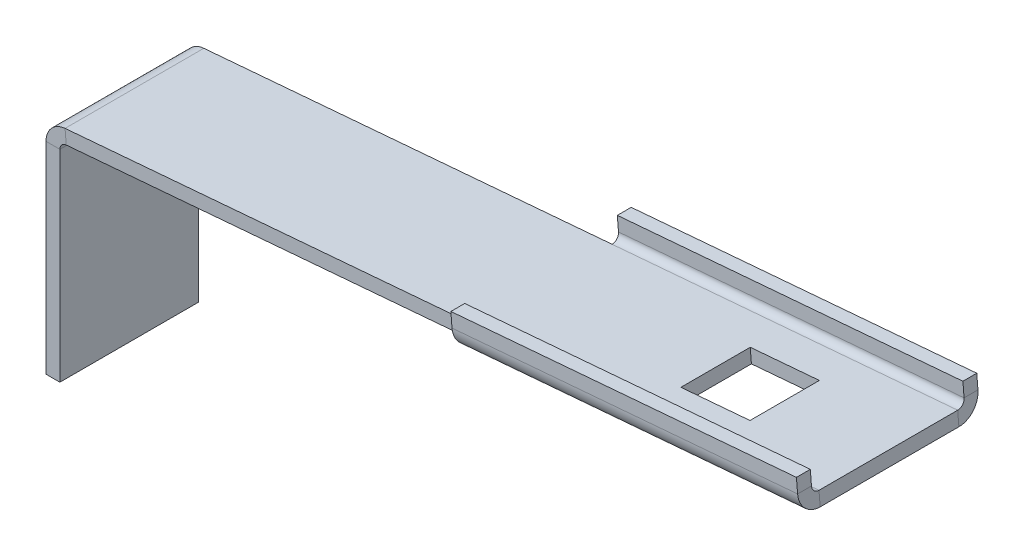
ISO-10303-21;
HEADER;
FILE_DESCRIPTION(('STEP AP214'),'2;1');
FILE_NAME('part.step','',(''),(''),'','','');
FILE_SCHEMA(('AUTOMOTIVE_DESIGN { 1 0 10303 214 1 1 1 1 }'));
ENDSEC;
DATA;
#1=APPLICATION_CONTEXT('core data for automotive mechanical design processes');
#2=APPLICATION_PROTOCOL_DEFINITION('international standard','automotive_design',2000,#1);
#3=PRODUCT_CONTEXT('',#1,'mechanical');
#4=PRODUCT('Part','Part','',(#3));
#5=PRODUCT_RELATED_PRODUCT_CATEGORY('part','',(#4));
#6=PRODUCT_DEFINITION_FORMATION('','',#4);
#7=PRODUCT_DEFINITION_CONTEXT('part definition',#1,'design');
#8=PRODUCT_DEFINITION('design','',#6,#7);
#9=PRODUCT_DEFINITION_SHAPE('','',#8);
#10=(LENGTH_UNIT() NAMED_UNIT(*) SI_UNIT(.MILLI.,.METRE.));
#11=(NAMED_UNIT(*) PLANE_ANGLE_UNIT() SI_UNIT($,.RADIAN.));
#12=(NAMED_UNIT(*) SI_UNIT($,.STERADIAN.) SOLID_ANGLE_UNIT());
#13=UNCERTAINTY_MEASURE_WITH_UNIT(LENGTH_MEASURE(1.E-05),#10,'distance_accuracy_value','');
#14=(GEOMETRIC_REPRESENTATION_CONTEXT(3) GLOBAL_UNCERTAINTY_ASSIGNED_CONTEXT((#13)) GLOBAL_UNIT_ASSIGNED_CONTEXT((#10,
#11,#12)) REPRESENTATION_CONTEXT('',''));
#15=CARTESIAN_POINT('',(0.,0.,0.));
#16=DIRECTION('',(0.,0.,1.));
#17=DIRECTION('',(1.,0.,0.));
#18=AXIS2_PLACEMENT_3D('',#15,#16,#17);
#19=CARTESIAN_POINT('',(-8.87020712806186,-0.625462256015466,0.));
#20=DIRECTION('',(0.,0.,-1.));
#21=DIRECTION('',(-1.,0.,0.));
#22=AXIS2_PLACEMENT_3D('',#19,#20,#21);
#23=PLANE('',#22);
#24=DIRECTION('',(0.996465756211304,0.0839999803466324,0.));
#25=VECTOR('',#24,1.);
#26=CARTESIAN_POINT('',(-8.68700712413119,-0.334244217847224,0.));
#27=LINE('',#26,#25);
#28=CARTESIAN_POINT('',(-8.59540712216585,-0.326522529152075,0.));
#29=VERTEX_POINT('',#28);
#30=CARTESIAN_POINT('',(-2.70821258686337,0.169755664232568,0.));
#31=VERTEX_POINT('',#30);
#32=EDGE_CURVE('E399',#29,#31,#27,.T.);
#33=ORIENTED_EDGE('',*,*,#32,.T.);
#34=DIRECTION('',(0.0839999803466327,-0.996465756211304,0.));
#35=VECTOR('',#34,1.);
#36=CARTESIAN_POINT('',(-2.70821258686337,0.169755664232568,0.));
#37=LINE('',#36,#35);
#38=CARTESIAN_POINT('',(-2.69141259079404,-0.0295374870096903,0.));
#39=VERTEX_POINT('',#38);
#40=EDGE_CURVE('E305',#31,#39,#37,.T.);
#41=ORIENTED_EDGE('',*,*,#40,.T.);
#42=DIRECTION('',(0.996465756211304,0.0839999803466324,0.));
#43=VECTOR('',#42,1.);
#44=CARTESIAN_POINT('',(-8.67020712806186,-0.533537369089485,0.));
#45=LINE('',#44,#43);
#46=CARTESIAN_POINT('',(-8.57860712609653,-0.525815680394336,0.));
#47=VERTEX_POINT('',#46);
#48=EDGE_CURVE('E369',#47,#39,#45,.T.);
#49=ORIENTED_EDGE('',*,*,#48,.F.);
#50=DIRECTION('',(-0.0839999803466367,0.996465756211303,0.));
#51=VECTOR('',#50,1.);
#52=CARTESIAN_POINT('',(-8.57860712609653,-0.525815680394336,0.));
#53=LINE('',#52,#51);
#54=EDGE_CURVE('E439',#47,#29,#53,.T.);
#55=ORIENTED_EDGE('',*,*,#54,.T.);
#56=EDGE_LOOP('',(#33,#41,#49,#55));
#57=FACE_BOUND('',#56,.T.);
#58=ADVANCED_FACE('F81',(#57),#23,.T.);
#59=CARTESIAN_POINT('',(-8.67020712806186,-0.625462256015466,2.));
#60=DIRECTION('',(0.,0.,1.));
#61=DIRECTION('',(1.,0.,0.));
#62=AXIS2_PLACEMENT_3D('',#59,#60,#61);
#63=PLANE('',#62);
#64=DIRECTION('',(-1.,0.,0.));
#65=VECTOR('',#64,1.);
#66=CARTESIAN_POINT('',(-8.67020712806186,-0.625462256015466,2.));
#67=LINE('',#66,#65);
#68=CARTESIAN_POINT('',(-8.67020712806186,-0.625462256015466,2.));
#69=VERTEX_POINT('',#68);
#70=CARTESIAN_POINT('',(-8.87020712806186,-0.625462256015466,2.));
#71=VERTEX_POINT('',#70);
#72=EDGE_CURVE('E13',#69,#71,#67,.T.);
#73=ORIENTED_EDGE('',*,*,#72,.F.);
#74=CARTESIAN_POINT('',(-8.57020712806186,-0.625462256015466,2.));
#75=DIRECTION('',(0.,0.,1.));
#76=DIRECTION('',(1.,0.,0.));
#77=AXIS2_PLACEMENT_3D('',#74,#75,#76);
#78=CIRCLE('',#77,0.1);
#79=CARTESIAN_POINT('',(-8.57860712609653,-0.525815680394336,2.));
#80=VERTEX_POINT('',#79);
#81=EDGE_CURVE('E391',#69,#80,#78,.F.);
#82=ORIENTED_EDGE('',*,*,#81,.T.);
#83=DIRECTION('',(0.0839999803466367,-0.996465756211303,0.));
#84=VECTOR('',#83,1.);
#85=CARTESIAN_POINT('',(-8.59540712216585,-0.326522529152075,2.));
#86=LINE('',#85,#84);
#87=CARTESIAN_POINT('',(-8.59540712216585,-0.326522529152075,2.));
#88=VERTEX_POINT('',#87);
#89=EDGE_CURVE('E89',#88,#80,#86,.T.);
#90=ORIENTED_EDGE('',*,*,#89,.F.);
#91=CARTESIAN_POINT('',(-8.57020712806186,-0.625462256015466,2.));
#92=DIRECTION('',(0.,0.,1.));
#93=DIRECTION('',(1.,0.,0.));
#94=AXIS2_PLACEMENT_3D('',#91,#92,#93);
#95=CIRCLE('',#94,0.3);
#96=EDGE_CURVE('E379',#71,#88,#95,.F.);
#97=ORIENTED_EDGE('',*,*,#96,.F.);
#98=EDGE_LOOP('',(#73,#82,#90,#97));
#99=FACE_BOUND('',#98,.T.);
#100=ADVANCED_FACE('F83',(#99),#63,.T.);
#101=CARTESIAN_POINT('',(-8.59540712216585,-0.326522529152075,2.));
#102=DIRECTION('',(0.,0.,1.));
#103=DIRECTION('',(1.,0.,0.));
#104=AXIS2_PLACEMENT_3D('',#101,#102,#103);
#105=PLANE('',#104);
#106=DIRECTION('',(0.,1.,0.));
#107=VECTOR('',#106,1.);
#108=CARTESIAN_POINT('',(-8.67020712806186,-3.53353736908948,2.));
#109=LINE('',#108,#107);
#110=CARTESIAN_POINT('',(-8.67020712806186,-3.53353736908948,2.));
#111=VERTEX_POINT('',#110);
#112=EDGE_CURVE('E388',#111,#69,#109,.T.);
#113=ORIENTED_EDGE('',*,*,#112,.T.);
#114=ORIENTED_EDGE('',*,*,#72,.T.);
#115=DIRECTION('',(0.,1.,0.));
#116=VECTOR('',#115,1.);
#117=CARTESIAN_POINT('',(-8.87020712806186,-3.53353736908948,2.));
#118=LINE('',#117,#116);
#119=CARTESIAN_POINT('',(-8.87020712806186,-3.53353736908948,2.));
#120=VERTEX_POINT('',#119);
#121=EDGE_CURVE('E382',#120,#71,#118,.T.);
#122=ORIENTED_EDGE('',*,*,#121,.F.);
#123=DIRECTION('',(-1.,0.,0.));
#124=VECTOR('',#123,1.);
#125=CARTESIAN_POINT('',(-8.67020712806186,-3.53353736908948,2.));
#126=LINE('',#125,#124);
#127=EDGE_CURVE('E385',#111,#120,#126,.T.);
#128=ORIENTED_EDGE('',*,*,#127,.F.);
#129=EDGE_LOOP('',(#113,#114,#122,#128));
#130=FACE_BOUND('',#129,.T.);
#131=ADVANCED_FACE('F500',(#130),#105,.T.);
#132=CARTESIAN_POINT('',(-8.57860712609653,-0.525815680394336,0.));
#133=DIRECTION('',(0.,0.,-1.));
#134=DIRECTION('',(-1.,0.,0.));
#135=AXIS2_PLACEMENT_3D('',#132,#133,#134);
#136=PLANE('',#135);
#137=ORIENTED_EDGE('',*,*,#54,.F.);
#138=CARTESIAN_POINT('',(-8.57020712806186,-0.625462256015466,0.));
#139=DIRECTION('',(0.,0.,1.));
#140=DIRECTION('',(1.,0.,0.));
#141=AXIS2_PLACEMENT_3D('',#138,#139,#140);
#142=CIRCLE('',#141,0.1);
#143=CARTESIAN_POINT('',(-8.67020712806186,-0.625462256015466,0.));
#144=VERTEX_POINT('',#143);
#145=EDGE_CURVE('E373',#144,#47,#142,.F.);
#146=ORIENTED_EDGE('',*,*,#145,.F.);
#147=DIRECTION('',(1.,0.,0.));
#148=VECTOR('',#147,1.);
#149=CARTESIAN_POINT('',(-8.87020712806186,-0.625462256015466,0.));
#150=LINE('',#149,#148);
#151=CARTESIAN_POINT('',(-8.87020712806186,-0.625462256015466,0.));
#152=VERTEX_POINT('',#151);
#153=EDGE_CURVE('E437',#152,#144,#150,.T.);
#154=ORIENTED_EDGE('',*,*,#153,.F.);
#155=CARTESIAN_POINT('',(-8.57020712806186,-0.625462256015466,0.));
#156=DIRECTION('',(0.,0.,1.));
#157=DIRECTION('',(1.,0.,0.));
#158=AXIS2_PLACEMENT_3D('',#155,#156,#157);
#159=CIRCLE('',#158,0.3);
#160=EDGE_CURVE('E402',#152,#29,#159,.F.);
#161=ORIENTED_EDGE('',*,*,#160,.T.);
#162=EDGE_LOOP('',(#137,#146,#154,#161));
#163=FACE_BOUND('',#162,.T.);
#164=ADVANCED_FACE('F504',(#163),#136,.T.);
#165=CARTESIAN_POINT('',(-8.67020712806186,-0.533537369089485,2.));
#166=DIRECTION('',(-0.0839999803466324,0.996465756211304,0.));
#167=DIRECTION('',(-0.996465756211304,-0.0839999803466324,0.));
#168=AXIS2_PLACEMENT_3D('',#165,#166,#167);
#169=PLANE('',#168);
#170=DIRECTION('',(0.,0.,-1.));
#171=VECTOR('',#170,1.);
#172=CARTESIAN_POINT('',(0.796217555945522,0.264462444203523,2.));
#173=LINE('',#172,#171);
#174=CARTESIAN_POINT('',(0.796217555945522,0.264462444203523,1.5));
#175=VERTEX_POINT('',#174);
#176=CARTESIAN_POINT('',(0.796217555945521,0.264462444203523,0.499999999999999));
#177=VERTEX_POINT('',#176);
#178=EDGE_CURVE('E260',#175,#177,#173,.T.);
#179=ORIENTED_EDGE('',*,*,#178,.T.);
#180=DIRECTION('',(-0.996465756211304,-0.0839999803466324,0.));
#181=VECTOR('',#180,1.);
#182=CARTESIAN_POINT('',(-8.67020712806186,-0.533537369089485,0.500000000000002));
#183=LINE('',#182,#181);
#184=CARTESIAN_POINT('',(-0.200248200265783,0.180462463856891,0.5));
#185=VERTEX_POINT('',#184);
#186=EDGE_CURVE('E263',#177,#185,#183,.T.);
#187=ORIENTED_EDGE('',*,*,#186,.T.);
#188=DIRECTION('',(0.,0.,1.));
#189=VECTOR('',#188,1.);
#190=CARTESIAN_POINT('',(-0.200248200265781,0.180462463856891,2.));
#191=LINE('',#190,#189);
#192=CARTESIAN_POINT('',(-0.200248200265782,0.180462463856891,1.5));
#193=VERTEX_POINT('',#192);
#194=EDGE_CURVE('E255',#185,#193,#191,.T.);
#195=ORIENTED_EDGE('',*,*,#194,.T.);
#196=DIRECTION('',(0.996465756211304,0.0839999803466324,0.));
#197=VECTOR('',#196,1.);
#198=CARTESIAN_POINT('',(-8.67020712806186,-0.533537369089485,1.5));
#199=LINE('',#198,#197);
#200=EDGE_CURVE('E235',#193,#175,#199,.T.);
#201=ORIENTED_EDGE('',*,*,#200,.T.);
#202=EDGE_LOOP('',(#179,#187,#195,#201));
#203=FACE_BOUND('',#202,.T.);
#204=ORIENTED_EDGE('',*,*,#48,.T.);
#205=DIRECTION('',(-0.996465756211304,-0.0839999803466327,0.));
#206=VECTOR('',#205,1.);
#207=CARTESIAN_POINT('',(-2.69141259079404,-0.0295374870096924,0.));
#208=LINE('',#207,#206);
#209=CARTESIAN_POINT('',(2.29091619026248,0.390462414723471,0.));
#210=VERTEX_POINT('',#209);
#211=EDGE_CURVE('E298',#39,#210,#208,.F.);
#212=ORIENTED_EDGE('',*,*,#211,.T.);
#213=DIRECTION('',(0.,0.,-1.));
#214=VECTOR('',#213,1.);
#215=CARTESIAN_POINT('',(2.29091619026248,0.390462414723472,2.));
#216=LINE('',#215,#214);
#217=CARTESIAN_POINT('',(2.29091619026248,0.390462414723472,2.));
#218=VERTEX_POINT('',#217);
#219=EDGE_CURVE('E434',#218,#210,#216,.T.);
#220=ORIENTED_EDGE('',*,*,#219,.F.);
#221=DIRECTION('',(0.996465756211304,0.0839999803466325,0.));
#222=VECTOR('',#221,1.);
#223=CARTESIAN_POINT('',(2.29091619026248,0.390462414723471,2.));
#224=LINE('',#223,#222);
#225=CARTESIAN_POINT('',(-2.69141259079404,-0.0295374870096912,2.));
#226=VERTEX_POINT('',#225);
#227=EDGE_CURVE('E349',#218,#226,#224,.F.);
#228=ORIENTED_EDGE('',*,*,#227,.T.);
#229=DIRECTION('',(0.996465756211304,0.0839999803466324,0.));
#230=VECTOR('',#229,1.);
#231=CARTESIAN_POINT('',(-8.67020712806186,-0.533537369089485,2.));
#232=LINE('',#231,#230);
#233=EDGE_CURVE('E370',#80,#226,#232,.T.);
#234=ORIENTED_EDGE('',*,*,#233,.F.);
#235=DIRECTION('',(0.,0.,-1.));
#236=VECTOR('',#235,1.);
#237=CARTESIAN_POINT('',(-8.57860712609653,-0.525815680394336,2.));
#238=LINE('',#237,#236);
#239=EDGE_CURVE('E394',#80,#47,#238,.T.);
#240=ORIENTED_EDGE('',*,*,#239,.T.);
#241=EDGE_LOOP('',(#204,#212,#220,#228,#234,#240));
#242=FACE_BOUND('',#241,.T.);
#243=ADVANCED_FACE('F454',(#203,#242),#169,.F.);
#244=CARTESIAN_POINT('',(2.27411619419315,0.589755565965733,2.));
#245=DIRECTION('',(0.996465756211303,0.0839999803466368,0.));
#246=DIRECTION('',(-0.0839999803466368,0.996465756211303,0.));
#247=AXIS2_PLACEMENT_3D('',#244,#245,#246);
#248=PLANE('',#247);
#249=DIRECTION('',(0.0839999803466368,-0.996465756211303,0.));
#250=VECTOR('',#249,1.);
#251=CARTESIAN_POINT('',(2.27411619419315,0.589755565965733,0.));
#252=LINE('',#251,#250);
#253=CARTESIAN_POINT('',(2.27411619419315,0.589755565965732,0.));
#254=VERTEX_POINT('',#253);
#255=EDGE_CURVE('E397',#254,#210,#252,.T.);
#256=ORIENTED_EDGE('',*,*,#255,.F.);
#257=DIRECTION('',(0.,0.,-1.));
#258=VECTOR('',#257,1.);
#259=CARTESIAN_POINT('',(2.27411619419315,0.589755565965733,2.));
#260=LINE('',#259,#258);
#261=CARTESIAN_POINT('',(2.27411619419315,0.589755565965733,2.));
#262=VERTEX_POINT('',#261);
#263=EDGE_CURVE('E431',#262,#254,#260,.T.);
#264=ORIENTED_EDGE('',*,*,#263,.F.);
#265=DIRECTION('',(0.0839999803466368,-0.996465756211303,0.));
#266=VECTOR('',#265,1.);
#267=CARTESIAN_POINT('',(2.27411619419315,0.589755565965733,2.));
#268=LINE('',#267,#266);
#269=EDGE_CURVE('E372',#262,#218,#268,.T.);
#270=ORIENTED_EDGE('',*,*,#269,.T.);
#271=ORIENTED_EDGE('',*,*,#219,.T.);
#272=EDGE_LOOP('',(#256,#264,#270,#271));
#273=FACE_BOUND('',#272,.T.);
#274=ADVANCED_FACE('F631',(#273),#248,.T.);
#275=CARTESIAN_POINT('',(-8.68700712413119,-0.334244217847224,2.));
#276=DIRECTION('',(-0.0839999803466324,0.996465756211304,0.));
#277=DIRECTION('',(-0.996465756211304,-0.0839999803466324,0.));
#278=AXIS2_PLACEMENT_3D('',#275,#276,#277);
#279=PLANE('',#278);
#280=DIRECTION('',(-0.996465756211304,-0.0839999803466324,0.));
#281=VECTOR('',#280,1.);
#282=CARTESIAN_POINT('',(-0.217048196335109,0.379755615099152,0.5));
#283=LINE('',#282,#281);
#284=CARTESIAN_POINT('',(0.779417559876194,0.463755595445784,0.499999999999999));
#285=VERTEX_POINT('',#284);
#286=CARTESIAN_POINT('',(-0.217048196335107,0.379755615099152,0.5));
#287=VERTEX_POINT('',#286);
#288=EDGE_CURVE('E104',#285,#287,#283,.T.);
#289=ORIENTED_EDGE('',*,*,#288,.F.);
#290=DIRECTION('',(0.,0.,-1.));
#291=VECTOR('',#290,1.);
#292=CARTESIAN_POINT('',(0.779417559876194,0.463755595445784,0.499999999999999));
#293=LINE('',#292,#291);
#294=CARTESIAN_POINT('',(0.779417559876194,0.463755595445784,1.5));
#295=VERTEX_POINT('',#294);
#296=EDGE_CURVE('E248',#295,#285,#293,.T.);
#297=ORIENTED_EDGE('',*,*,#296,.F.);
#298=DIRECTION('',(0.996465756211304,0.0839999803466324,0.));
#299=VECTOR('',#298,1.);
#300=CARTESIAN_POINT('',(-0.217048196335109,0.379755615099152,1.5));
#301=LINE('',#300,#299);
#302=CARTESIAN_POINT('',(-0.217048196335109,0.379755615099152,1.5));
#303=VERTEX_POINT('',#302);
#304=EDGE_CURVE('E232',#303,#295,#301,.T.);
#305=ORIENTED_EDGE('',*,*,#304,.F.);
#306=DIRECTION('',(0.,0.,1.));
#307=VECTOR('',#306,1.);
#308=CARTESIAN_POINT('',(-0.217048196335109,0.379755615099152,0.5));
#309=LINE('',#308,#307);
#310=EDGE_CURVE('E241',#287,#303,#309,.T.);
#311=ORIENTED_EDGE('',*,*,#310,.F.);
#312=EDGE_LOOP('',(#289,#297,#305,#311));
#313=FACE_BOUND('',#312,.T.);
#314=ORIENTED_EDGE('',*,*,#32,.F.);
#315=DIRECTION('',(0.,0.,-1.));
#316=VECTOR('',#315,1.);
#317=CARTESIAN_POINT('',(-8.59540712216585,-0.326522529152075,2.));
#318=LINE('',#317,#316);
#319=EDGE_CURVE('E428',#88,#29,#318,.T.);
#320=ORIENTED_EDGE('',*,*,#319,.F.);
#321=DIRECTION('',(0.996465756211304,0.0839999803466324,0.));
#322=VECTOR('',#321,1.);
#323=CARTESIAN_POINT('',(-8.68700712413119,-0.334244217847224,2.));
#324=LINE('',#323,#322);
#325=CARTESIAN_POINT('',(-2.70821258686337,0.16975566423257,2.));
#326=VERTEX_POINT('',#325);
#327=EDGE_CURVE('E376',#88,#326,#324,.T.);
#328=ORIENTED_EDGE('',*,*,#327,.T.);
#329=DIRECTION('',(0.996465756211304,0.0839999803466325,0.));
#330=VECTOR('',#329,1.);
#331=CARTESIAN_POINT('',(2.27411619419315,0.589755565965732,2.));
#332=LINE('',#331,#330);
#333=EDGE_CURVE('E362',#262,#326,#332,.F.);
#334=ORIENTED_EDGE('',*,*,#333,.F.);
#335=ORIENTED_EDGE('',*,*,#263,.T.);
#336=DIRECTION('',(-0.996465756211304,-0.0839999803466327,0.));
#337=VECTOR('',#336,1.);
#338=CARTESIAN_POINT('',(-2.70821258686337,0.169755664232568,0.));
#339=LINE('',#338,#337);
#340=EDGE_CURVE('E310',#31,#254,#339,.F.);
#341=ORIENTED_EDGE('',*,*,#340,.F.);
#342=EDGE_LOOP('',(#314,#320,#328,#334,#335,#341));
#343=FACE_BOUND('',#342,.T.);
#344=ADVANCED_FACE('F245',(#313,#343),#279,.T.);
#345=CARTESIAN_POINT('',(-8.57020712806186,-0.625462256015466,2.));
#346=DIRECTION('',(0.,0.,-1.));
#347=DIRECTION('',(-1.,0.,0.));
#348=AXIS2_PLACEMENT_3D('',#345,#346,#347);
#349=CYLINDRICAL_SURFACE('',#348,0.3);
#350=ORIENTED_EDGE('',*,*,#160,.F.);
#351=DIRECTION('',(0.,0.,-1.));
#352=VECTOR('',#351,1.);
#353=CARTESIAN_POINT('',(-8.87020712806186,-0.625462256015466,2.));
#354=LINE('',#353,#352);
#355=EDGE_CURVE('E425',#71,#152,#354,.T.);
#356=ORIENTED_EDGE('',*,*,#355,.F.);
#357=ORIENTED_EDGE('',*,*,#96,.T.);
#358=ORIENTED_EDGE('',*,*,#319,.T.);
#359=EDGE_LOOP('',(#350,#356,#357,#358));
#360=FACE_BOUND('',#359,.T.);
#361=ADVANCED_FACE('F522',(#360),#349,.T.);
#362=CARTESIAN_POINT('',(-8.87020712806186,-3.53353736908948,2.));
#363=DIRECTION('',(-1.,0.,0.));
#364=DIRECTION('',(0.,0.,1.));
#365=AXIS2_PLACEMENT_3D('',#362,#363,#364);
#366=PLANE('',#365);
#367=DIRECTION('',(0.,1.,0.));
#368=VECTOR('',#367,1.);
#369=CARTESIAN_POINT('',(-8.87020712806186,-3.53353736908948,0.));
#370=LINE('',#369,#368);
#371=CARTESIAN_POINT('',(-8.87020712806186,-3.53353736908948,0.));
#372=VERTEX_POINT('',#371);
#373=EDGE_CURVE('E405',#372,#152,#370,.T.);
#374=ORIENTED_EDGE('',*,*,#373,.F.);
#375=DIRECTION('',(0.,0.,-1.));
#376=VECTOR('',#375,1.);
#377=CARTESIAN_POINT('',(-8.87020712806186,-3.53353736908948,2.));
#378=LINE('',#377,#376);
#379=EDGE_CURVE('E423',#120,#372,#378,.T.);
#380=ORIENTED_EDGE('',*,*,#379,.F.);
#381=ORIENTED_EDGE('',*,*,#121,.T.);
#382=ORIENTED_EDGE('',*,*,#355,.T.);
#383=EDGE_LOOP('',(#374,#380,#381,#382));
#384=FACE_BOUND('',#383,.T.);
#385=ADVANCED_FACE('F803',(#384),#366,.T.);
#386=CARTESIAN_POINT('',(-8.67020712806186,-3.53353736908948,2.));
#387=DIRECTION('',(0.,-1.,0.));
#388=DIRECTION('',(0.,0.,-1.));
#389=AXIS2_PLACEMENT_3D('',#386,#387,#388);
#390=PLANE('',#389);
#391=DIRECTION('',(-1.,0.,0.));
#392=VECTOR('',#391,1.);
#393=CARTESIAN_POINT('',(-8.67020712806186,-3.53353736908948,0.));
#394=LINE('',#393,#392);
#395=CARTESIAN_POINT('',(-8.67020712806186,-3.53353736908948,0.));
#396=VERTEX_POINT('',#395);
#397=EDGE_CURVE('E408',#396,#372,#394,.T.);
#398=ORIENTED_EDGE('',*,*,#397,.F.);
#399=DIRECTION('',(0.,0.,-1.));
#400=VECTOR('',#399,1.);
#401=CARTESIAN_POINT('',(-8.67020712806186,-3.53353736908948,2.));
#402=LINE('',#401,#400);
#403=EDGE_CURVE('E421',#111,#396,#402,.T.);
#404=ORIENTED_EDGE('',*,*,#403,.F.);
#405=ORIENTED_EDGE('',*,*,#127,.T.);
#406=ORIENTED_EDGE('',*,*,#379,.T.);
#407=EDGE_LOOP('',(#398,#404,#405,#406));
#408=FACE_BOUND('',#407,.T.);
#409=ADVANCED_FACE('F836',(#408),#390,.T.);
#410=CARTESIAN_POINT('',(-8.67020712806186,-3.53353736908948,2.));
#411=DIRECTION('',(-1.,0.,0.));
#412=DIRECTION('',(0.,0.,1.));
#413=AXIS2_PLACEMENT_3D('',#410,#411,#412);
#414=PLANE('',#413);
#415=DIRECTION('',(0.,1.,0.));
#416=VECTOR('',#415,1.);
#417=CARTESIAN_POINT('',(-8.67020712806186,-3.53353736908948,0.));
#418=LINE('',#417,#416);
#419=EDGE_CURVE('E411',#396,#144,#418,.T.);
#420=ORIENTED_EDGE('',*,*,#419,.T.);
#421=DIRECTION('',(0.,0.,-1.));
#422=VECTOR('',#421,1.);
#423=CARTESIAN_POINT('',(-8.67020712806186,-0.625462256015466,2.));
#424=LINE('',#423,#422);
#425=EDGE_CURVE('E418',#69,#144,#424,.T.);
#426=ORIENTED_EDGE('',*,*,#425,.F.);
#427=ORIENTED_EDGE('',*,*,#112,.F.);
#428=ORIENTED_EDGE('',*,*,#403,.T.);
#429=EDGE_LOOP('',(#420,#426,#427,#428));
#430=FACE_BOUND('',#429,.T.);
#431=ADVANCED_FACE('F517',(#430),#414,.F.);
#432=CARTESIAN_POINT('',(-8.57020712806186,-0.625462256015466,2.));
#433=DIRECTION('',(0.,0.,-1.));
#434=DIRECTION('',(-1.,0.,0.));
#435=AXIS2_PLACEMENT_3D('',#432,#433,#434);
#436=CYLINDRICAL_SURFACE('',#435,0.1);
#437=ORIENTED_EDGE('',*,*,#145,.T.);
#438=ORIENTED_EDGE('',*,*,#239,.F.);
#439=ORIENTED_EDGE('',*,*,#81,.F.);
#440=ORIENTED_EDGE('',*,*,#425,.T.);
#441=EDGE_LOOP('',(#437,#438,#439,#440));
#442=FACE_BOUND('',#441,.T.);
#443=ADVANCED_FACE('F450',(#442),#436,.F.);
#444=CARTESIAN_POINT('',(-8.57020712806186,-0.625462256015466,2.));
#445=DIRECTION('',(0.,0.,1.));
#446=DIRECTION('',(1.,0.,0.));
#447=AXIS2_PLACEMENT_3D('',#444,#445,#446);
#448=PLANE('',#447);
#449=DIRECTION('',(0.0839999803466452,-0.996465756211303,0.));
#450=VECTOR('',#449,1.);
#451=CARTESIAN_POINT('',(-2.70821258686337,0.16975566423257,2.));
#452=LINE('',#451,#450);
#453=EDGE_CURVE('E356',#326,#226,#452,.T.);
#454=ORIENTED_EDGE('',*,*,#453,.F.);
#455=ORIENTED_EDGE('',*,*,#327,.F.);
#456=ORIENTED_EDGE('',*,*,#89,.T.);
#457=ORIENTED_EDGE('',*,*,#233,.T.);
#458=EDGE_LOOP('',(#454,#455,#456,#457));
#459=FACE_BOUND('',#458,.T.);
#460=ADVANCED_FACE('F442',(#459),#448,.T.);
#461=CARTESIAN_POINT('',(-8.57020712806186,-0.625462256015466,0.));
#462=DIRECTION('',(0.,0.,1.));
#463=DIRECTION('',(1.,0.,0.));
#464=AXIS2_PLACEMENT_3D('',#461,#462,#463);
#465=PLANE('',#464);
#466=ORIENTED_EDGE('',*,*,#373,.T.);
#467=ORIENTED_EDGE('',*,*,#153,.T.);
#468=ORIENTED_EDGE('',*,*,#419,.F.);
#469=ORIENTED_EDGE('',*,*,#397,.T.);
#470=EDGE_LOOP('',(#466,#467,#468,#469));
#471=FACE_BOUND('',#470,.T.);
#472=ADVANCED_FACE('F784',(#471),#465,.F.);
#473=CARTESIAN_POINT('',(-2.71661258489803,0.2694022398537,2.));
#474=DIRECTION('',(-0.996465756211304,-0.0839999803466325,0.));
#475=DIRECTION('',(0.0839999803466325,-0.996465756211304,0.));
#476=AXIS2_PLACEMENT_3D('',#473,#474,#475);
#477=PLANE('',#476);
#478=DIRECTION('',(0.,0.,1.));
#479=VECTOR('',#478,1.);
#480=CARTESIAN_POINT('',(-2.71661258489803,0.2694022398537,2.3));
#481=LINE('',#480,#479);
#482=CARTESIAN_POINT('',(-2.71661258489803,0.2694022398537,2.1));
#483=VERTEX_POINT('',#482);
#484=CARTESIAN_POINT('',(-2.71661258489803,0.269402239853699,2.3));
#485=VERTEX_POINT('',#484);
#486=EDGE_CURVE('E316',#483,#485,#481,.T.);
#487=ORIENTED_EDGE('',*,*,#486,.F.);
#488=CARTESIAN_POINT('',(-2.71661258489803,0.2694022398537,2.));
#489=DIRECTION('',(0.996465756211304,0.0839999803466325,0.));
#490=DIRECTION('',(-0.0839999803466325,0.996465756211304,0.));
#491=AXIS2_PLACEMENT_3D('',#488,#489,#490);
#492=CIRCLE('',#491,0.1);
#493=EDGE_CURVE('E359',#326,#483,#492,.F.);
#494=ORIENTED_EDGE('',*,*,#493,.F.);
#495=ORIENTED_EDGE('',*,*,#453,.T.);
#496=CARTESIAN_POINT('',(-2.71661258489803,0.2694022398537,2.));
#497=DIRECTION('',(0.996465756211304,0.0839999803466325,0.));
#498=DIRECTION('',(-0.0839999803466325,0.996465756211304,0.));
#499=AXIS2_PLACEMENT_3D('',#496,#497,#498);
#500=CIRCLE('',#499,0.3);
#501=EDGE_CURVE('E352',#226,#485,#500,.F.);
#502=ORIENTED_EDGE('',*,*,#501,.T.);
#503=EDGE_LOOP('',(#487,#494,#495,#502));
#504=FACE_BOUND('',#503,.T.);
#505=ADVANCED_FACE('F460',(#504),#477,.T.);
#506=CARTESIAN_POINT('',(2.26571619615849,0.689402141586863,2.));
#507=DIRECTION('',(-0.996465756211304,-0.0839999803466325,0.));
#508=DIRECTION('',(0.0839999803466325,-0.996465756211304,0.));
#509=AXIS2_PLACEMENT_3D('',#506,#507,#508);
#510=PLANE('',#509);
#511=CARTESIAN_POINT('',(2.26571619615849,0.689402141586863,2.));
#512=DIRECTION('',(0.996465756211304,0.0839999803466325,0.));
#513=DIRECTION('',(-0.0839999803466325,0.996465756211304,0.));
#514=AXIS2_PLACEMENT_3D('',#511,#512,#513);
#515=CIRCLE('',#514,0.1);
#516=CARTESIAN_POINT('',(2.26571619615849,0.689402141586863,2.1));
#517=VERTEX_POINT('',#516);
#518=EDGE_CURVE('E319',#517,#262,#515,.T.);
#519=ORIENTED_EDGE('',*,*,#518,.F.);
#520=DIRECTION('',(0.,0.,1.));
#521=VECTOR('',#520,1.);
#522=CARTESIAN_POINT('',(2.26571619615849,0.689402141586863,2.1));
#523=LINE('',#522,#521);
#524=CARTESIAN_POINT('',(2.26571619615849,0.689402141586863,2.3));
#525=VERTEX_POINT('',#524);
#526=EDGE_CURVE('E342',#517,#525,#523,.T.);
#527=ORIENTED_EDGE('',*,*,#526,.T.);
#528=CARTESIAN_POINT('',(2.26571619615849,0.689402141586863,2.));
#529=DIRECTION('',(0.996465756211304,0.0839999803466325,0.));
#530=DIRECTION('',(-0.0839999803466325,0.996465756211304,0.));
#531=AXIS2_PLACEMENT_3D('',#528,#529,#530);
#532=CIRCLE('',#531,0.3);
#533=EDGE_CURVE('E353',#525,#218,#532,.T.);
#534=ORIENTED_EDGE('',*,*,#533,.T.);
#535=ORIENTED_EDGE('',*,*,#269,.F.);
#536=EDGE_LOOP('',(#519,#527,#534,#535));
#537=FACE_BOUND('',#536,.T.);
#538=ADVANCED_FACE('F767',(#537),#510,.F.);
#539=CARTESIAN_POINT('',(2.26571619615849,0.689402141586863,2.));
#540=DIRECTION('',(0.996465756211304,0.0839999803466325,0.));
#541=DIRECTION('',(0.,0.,1.));
#542=AXIS2_PLACEMENT_3D('',#539,#540,#541);
#543=CYLINDRICAL_SURFACE('',#542,0.3);
#544=ORIENTED_EDGE('',*,*,#227,.F.);
#545=ORIENTED_EDGE('',*,*,#533,.F.);
#546=DIRECTION('',(0.996465756211304,0.0839999803466325,0.));
#547=VECTOR('',#546,1.);
#548=CARTESIAN_POINT('',(-0.0417182131129848,0.494890244091365,2.3));
#549=LINE('',#548,#547);
#550=EDGE_CURVE('E339',#485,#525,#549,.T.);
#551=ORIENTED_EDGE('',*,*,#550,.F.);
#552=ORIENTED_EDGE('',*,*,#501,.F.);
#553=EDGE_LOOP('',(#544,#545,#551,#552));
#554=FACE_BOUND('',#553,.T.);
#555=ADVANCED_FACE('F461',(#554),#543,.T.);
#556=CARTESIAN_POINT('',(2.26571619615849,0.689402141586863,2.));
#557=DIRECTION('',(0.996465756211304,0.0839999803466325,0.));
#558=DIRECTION('',(0.,0.,1.));
#559=AXIS2_PLACEMENT_3D('',#556,#557,#558);
#560=CYLINDRICAL_SURFACE('',#559,0.1);
#561=ORIENTED_EDGE('',*,*,#333,.T.);
#562=ORIENTED_EDGE('',*,*,#493,.T.);
#563=DIRECTION('',(-0.996465756211304,-0.0839999803466325,0.));
#564=VECTOR('',#563,1.);
#565=CARTESIAN_POINT('',(-2.71661258489803,0.2694022398537,2.1));
#566=LINE('',#565,#564);
#567=EDGE_CURVE('E345',#483,#517,#566,.F.);
#568=ORIENTED_EDGE('',*,*,#567,.T.);
#569=ORIENTED_EDGE('',*,*,#518,.T.);
#570=EDGE_LOOP('',(#561,#562,#568,#569));
#571=FACE_BOUND('',#570,.T.);
#572=ADVANCED_FACE('F480',(#571),#560,.F.);
#573=CARTESIAN_POINT('',(2.27411619419315,0.589755565965732,2.3));
#574=DIRECTION('',(0.996465756211304,0.0839999803466324,0.));
#575=DIRECTION('',(-0.0839999803466324,0.996465756211304,0.));
#576=AXIS2_PLACEMENT_3D('',#573,#574,#575);
#577=PLANE('',#576);
#578=DIRECTION('',(0.0839999803466324,-0.996465756211304,0.));
#579=VECTOR('',#578,1.);
#580=CARTESIAN_POINT('',(2.27411619419315,0.589755565965732,2.3));
#581=LINE('',#580,#579);
#582=CARTESIAN_POINT('',(2.24891620008916,0.888695292829123,2.3));
#583=VERTEX_POINT('',#582);
#584=EDGE_CURVE('E323',#583,#525,#581,.T.);
#585=ORIENTED_EDGE('',*,*,#584,.T.);
#586=ORIENTED_EDGE('',*,*,#526,.F.);
#587=DIRECTION('',(-0.0839999803466324,0.996465756211304,0.));
#588=VECTOR('',#587,1.);
#589=CARTESIAN_POINT('',(2.30743440927147,0.194511897495492,2.1));
#590=LINE('',#589,#588);
#591=CARTESIAN_POINT('',(2.24891620008916,0.888695292829124,2.1));
#592=VERTEX_POINT('',#591);
#593=EDGE_CURVE('E331',#592,#517,#590,.F.);
#594=ORIENTED_EDGE('',*,*,#593,.F.);
#595=DIRECTION('',(0.,0.,-1.));
#596=VECTOR('',#595,1.);
#597=CARTESIAN_POINT('',(2.24891620008916,0.888695292829123,2.3));
#598=LINE('',#597,#596);
#599=EDGE_CURVE('E317',#583,#592,#598,.T.);
#600=ORIENTED_EDGE('',*,*,#599,.F.);
#601=EDGE_LOOP('',(#585,#586,#594,#600));
#602=FACE_BOUND('',#601,.T.);
#603=ADVANCED_FACE('F469',(#602),#577,.T.);
#604=CARTESIAN_POINT('',(-2.73341258096736,0.468695391095961,2.3));
#605=DIRECTION('',(-0.996465756211304,-0.0839999803466324,0.));
#606=DIRECTION('',(0.0839999803466324,-0.996465756211304,0.));
#607=AXIS2_PLACEMENT_3D('',#604,#605,#606);
#608=PLANE('',#607);
#609=DIRECTION('',(0.0839999803466324,-0.996465756211304,0.));
#610=VECTOR('',#609,1.);
#611=CARTESIAN_POINT('',(-2.67489437178505,-0.22548800423767,2.1));
#612=LINE('',#611,#610);
#613=CARTESIAN_POINT('',(-2.73341258096736,0.468695391095961,2.1));
#614=VERTEX_POINT('',#613);
#615=EDGE_CURVE('E337',#483,#614,#612,.F.);
#616=ORIENTED_EDGE('',*,*,#615,.F.);
#617=ORIENTED_EDGE('',*,*,#486,.T.);
#618=DIRECTION('',(-0.0839999803466324,0.996465756211304,0.));
#619=VECTOR('',#618,1.);
#620=CARTESIAN_POINT('',(-2.73341258096736,0.468695391095961,2.3));
#621=LINE('',#620,#619);
#622=CARTESIAN_POINT('',(-2.73341258096736,0.468695391095961,2.3));
#623=VERTEX_POINT('',#622);
#624=EDGE_CURVE('E329',#485,#623,#621,.T.);
#625=ORIENTED_EDGE('',*,*,#624,.T.);
#626=DIRECTION('',(0.,0.,-1.));
#627=VECTOR('',#626,1.);
#628=CARTESIAN_POINT('',(-2.73341258096736,0.468695391095961,2.3));
#629=LINE('',#628,#627);
#630=EDGE_CURVE('E320',#623,#614,#629,.T.);
#631=ORIENTED_EDGE('',*,*,#630,.T.);
#632=EDGE_LOOP('',(#616,#617,#625,#631));
#633=FACE_BOUND('',#632,.T.);
#634=ADVANCED_FACE('F477',(#633),#608,.T.);
#635=CARTESIAN_POINT('',(0.,0.,2.3));
#636=DIRECTION('',(0.,0.,1.));
#637=DIRECTION('',(0.,-1.,0.));
#638=AXIS2_PLACEMENT_3D('',#635,#636,#637);
#639=PLANE('',#638);
#640=ORIENTED_EDGE('',*,*,#624,.F.);
#641=ORIENTED_EDGE('',*,*,#550,.T.);
#642=ORIENTED_EDGE('',*,*,#584,.F.);
#643=DIRECTION('',(0.996465756211304,0.0839999803466324,0.));
#644=VECTOR('',#643,1.);
#645=CARTESIAN_POINT('',(2.24891620008916,0.888695292829123,2.3));
#646=LINE('',#645,#644);
#647=EDGE_CURVE('E326',#623,#583,#646,.T.);
#648=ORIENTED_EDGE('',*,*,#647,.F.);
#649=EDGE_LOOP('',(#640,#641,#642,#648));
#650=FACE_BOUND('',#649,.T.);
#651=ADVANCED_FACE('F465',(#650),#639,.T.);
#652=CARTESIAN_POINT('',(0.,0.,2.1));
#653=DIRECTION('',(0.,0.,1.));
#654=DIRECTION('',(0.,-1.,0.));
#655=AXIS2_PLACEMENT_3D('',#652,#653,#654);
#656=PLANE('',#655);
#657=ORIENTED_EDGE('',*,*,#567,.F.);
#658=ORIENTED_EDGE('',*,*,#615,.T.);
#659=DIRECTION('',(-0.996465756211304,-0.0839999803466324,0.));
#660=VECTOR('',#659,1.);
#661=CARTESIAN_POINT('',(-0.0585182091823113,0.694183395333626,2.1));
#662=LINE('',#661,#660);
#663=EDGE_CURVE('E334',#614,#592,#662,.F.);
#664=ORIENTED_EDGE('',*,*,#663,.T.);
#665=ORIENTED_EDGE('',*,*,#593,.T.);
#666=EDGE_LOOP('',(#657,#658,#664,#665));
#667=FACE_BOUND('',#666,.T.);
#668=ADVANCED_FACE('F483',(#667),#656,.F.);
#669=CARTESIAN_POINT('',(2.24891620008916,0.888695292829123,2.3));
#670=DIRECTION('',(-0.0839999803466324,0.996465756211304,0.));
#671=DIRECTION('',(-0.996465756211304,-0.0839999803466324,0.));
#672=AXIS2_PLACEMENT_3D('',#669,#670,#671);
#673=PLANE('',#672);
#674=ORIENTED_EDGE('',*,*,#663,.F.);
#675=ORIENTED_EDGE('',*,*,#630,.F.);
#676=ORIENTED_EDGE('',*,*,#647,.T.);
#677=ORIENTED_EDGE('',*,*,#599,.T.);
#678=EDGE_LOOP('',(#674,#675,#676,#677));
#679=FACE_BOUND('',#678,.T.);
#680=ADVANCED_FACE('F474',(#679),#673,.T.);
#681=CARTESIAN_POINT('',(2.26571619615849,0.689402141586862,0.));
#682=DIRECTION('',(0.996465756211304,0.0839999803466327,0.));
#683=DIRECTION('',(-0.0839999803466327,0.996465756211304,0.));
#684=AXIS2_PLACEMENT_3D('',#681,#682,#683);
#685=PLANE('',#684);
#686=DIRECTION('',(0.,0.,-1.));
#687=VECTOR('',#686,1.);
#688=CARTESIAN_POINT('',(2.26571619615849,0.689402141586864,-0.299999999999999));
#689=LINE('',#688,#687);
#690=CARTESIAN_POINT('',(2.26571619615849,0.689402141586862,-0.1));
#691=VERTEX_POINT('',#690);
#692=CARTESIAN_POINT('',(2.26571619615849,0.689402141586861,-0.3));
#693=VERTEX_POINT('',#692);
#694=EDGE_CURVE('E266',#691,#693,#689,.T.);
#695=ORIENTED_EDGE('',*,*,#694,.F.);
#696=CARTESIAN_POINT('',(2.26571619615849,0.689402141586862,0.));
#697=DIRECTION('',(-0.996465756211304,-0.0839999803466327,0.));
#698=DIRECTION('',(0.0839999803466327,-0.996465756211304,0.));
#699=AXIS2_PLACEMENT_3D('',#696,#697,#698);
#700=CIRCLE('',#699,0.1);
#701=EDGE_CURVE('E307',#254,#691,#700,.F.);
#702=ORIENTED_EDGE('',*,*,#701,.F.);
#703=ORIENTED_EDGE('',*,*,#255,.T.);
#704=CARTESIAN_POINT('',(2.26571619615849,0.689402141586862,0.));
#705=DIRECTION('',(-0.996465756211304,-0.0839999803466327,0.));
#706=DIRECTION('',(0.0839999803466327,-0.996465756211304,0.));
#707=AXIS2_PLACEMENT_3D('',#704,#705,#706);
#708=CIRCLE('',#707,0.3);
#709=EDGE_CURVE('E301',#210,#693,#708,.F.);
#710=ORIENTED_EDGE('',*,*,#709,.T.);
#711=EDGE_LOOP('',(#695,#702,#703,#710));
#712=FACE_BOUND('',#711,.T.);
#713=ADVANCED_FACE('F490',(#712),#685,.T.);
#714=CARTESIAN_POINT('',(-2.71661258489803,0.269402239853699,0.));
#715=DIRECTION('',(0.996465756211304,0.0839999803466327,0.));
#716=DIRECTION('',(-0.0839999803466327,0.996465756211304,0.));
#717=AXIS2_PLACEMENT_3D('',#714,#715,#716);
#718=PLANE('',#717);
#719=CARTESIAN_POINT('',(-2.71661258489803,0.269402239853699,0.));
#720=DIRECTION('',(-0.996465756211304,-0.0839999803466327,0.));
#721=DIRECTION('',(0.0839999803466327,-0.996465756211304,0.));
#722=AXIS2_PLACEMENT_3D('',#719,#720,#721);
#723=CIRCLE('',#722,0.1);
#724=CARTESIAN_POINT('',(-2.71661258489803,0.269402239853698,-0.1));
#725=VERTEX_POINT('',#724);
#726=EDGE_CURVE('E269',#725,#31,#723,.T.);
#727=ORIENTED_EDGE('',*,*,#726,.F.);
#728=DIRECTION('',(0.,0.,-1.));
#729=VECTOR('',#728,1.);
#730=CARTESIAN_POINT('',(-2.71661258489803,0.2694022398537,-0.1));
#731=LINE('',#730,#729);
#732=CARTESIAN_POINT('',(-2.71661258489803,0.269402239853701,-0.3));
#733=VERTEX_POINT('',#732);
#734=EDGE_CURVE('E291',#725,#733,#731,.T.);
#735=ORIENTED_EDGE('',*,*,#734,.T.);
#736=CARTESIAN_POINT('',(-2.71661258489803,0.269402239853699,0.));
#737=DIRECTION('',(-0.996465756211304,-0.0839999803466327,0.));
#738=DIRECTION('',(0.0839999803466327,-0.996465756211304,0.));
#739=AXIS2_PLACEMENT_3D('',#736,#737,#738);
#740=CIRCLE('',#739,0.3);
#741=EDGE_CURVE('E302',#733,#39,#740,.T.);
#742=ORIENTED_EDGE('',*,*,#741,.T.);
#743=ORIENTED_EDGE('',*,*,#40,.F.);
#744=EDGE_LOOP('',(#727,#735,#742,#743));
#745=FACE_BOUND('',#744,.T.);
#746=ADVANCED_FACE('F551',(#745),#718,.F.);
#747=CARTESIAN_POINT('',(-2.71661258489803,0.269402239853699,0.));
#748=DIRECTION('',(-0.996465756211304,-0.0839999803466327,0.));
#749=DIRECTION('',(0.,0.,-1.));
#750=AXIS2_PLACEMENT_3D('',#747,#748,#749);
#751=CYLINDRICAL_SURFACE('',#750,0.3);
#752=ORIENTED_EDGE('',*,*,#211,.F.);
#753=ORIENTED_EDGE('',*,*,#741,.F.);
#754=DIRECTION('',(-0.996465756211304,-0.0839999803466326,0.));
#755=VECTOR('',#754,1.);
#756=CARTESIAN_POINT('',(2.26571619615849,0.689402141586864,-0.3));
#757=LINE('',#756,#755);
#758=EDGE_CURVE('E289',#733,#693,#757,.F.);
#759=ORIENTED_EDGE('',*,*,#758,.T.);
#760=ORIENTED_EDGE('',*,*,#709,.F.);
#761=EDGE_LOOP('',(#752,#753,#759,#760));
#762=FACE_BOUND('',#761,.T.);
#763=ADVANCED_FACE('F567',(#762),#751,.T.);
#764=CARTESIAN_POINT('',(-2.71661258489803,0.269402239853699,0.));
#765=DIRECTION('',(-0.996465756211304,-0.0839999803466327,0.));
#766=DIRECTION('',(0.,0.,-1.));
#767=AXIS2_PLACEMENT_3D('',#764,#765,#766);
#768=CYLINDRICAL_SURFACE('',#767,0.1);
#769=ORIENTED_EDGE('',*,*,#340,.T.);
#770=ORIENTED_EDGE('',*,*,#701,.T.);
#771=DIRECTION('',(-0.996465756211304,-0.0839999803466326,0.));
#772=VECTOR('',#771,1.);
#773=CARTESIAN_POINT('',(2.26571619615849,0.689402141586863,-0.1));
#774=LINE('',#773,#772);
#775=EDGE_CURVE('E294',#691,#725,#774,.T.);
#776=ORIENTED_EDGE('',*,*,#775,.T.);
#777=ORIENTED_EDGE('',*,*,#726,.T.);
#778=EDGE_LOOP('',(#769,#770,#776,#777));
#779=FACE_BOUND('',#778,.T.);
#780=ADVANCED_FACE('F528',(#779),#768,.F.);
#781=CARTESIAN_POINT('',(2.27411619419315,0.589755565965732,-0.3));
#782=DIRECTION('',(0.996465756211304,0.0839999803466325,0.));
#783=DIRECTION('',(-0.0839999803466325,0.996465756211304,0.));
#784=AXIS2_PLACEMENT_3D('',#781,#782,#783);
#785=PLANE('',#784);
#786=DIRECTION('',(-0.0839999803466325,0.996465756211304,0.));
#787=VECTOR('',#786,1.);
#788=CARTESIAN_POINT('',(2.30743440927147,0.194511897495498,-0.0999999999999983));
#789=LINE('',#788,#787);
#790=CARTESIAN_POINT('',(2.24891620008916,0.888695292829124,-0.100000000000001));
#791=VERTEX_POINT('',#790);
#792=EDGE_CURVE('E287',#691,#791,#789,.T.);
#793=ORIENTED_EDGE('',*,*,#792,.F.);
#794=ORIENTED_EDGE('',*,*,#694,.T.);
#795=DIRECTION('',(0.0839999803466325,-0.996465756211304,0.));
#796=VECTOR('',#795,1.);
#797=CARTESIAN_POINT('',(2.27411619419315,0.589755565965732,-0.3));
#798=LINE('',#797,#796);
#799=CARTESIAN_POINT('',(2.24891620008916,0.888695292829123,-0.300000000000001));
#800=VERTEX_POINT('',#799);
#801=EDGE_CURVE('E279',#693,#800,#798,.F.);
#802=ORIENTED_EDGE('',*,*,#801,.T.);
#803=DIRECTION('',(0.,0.,1.));
#804=VECTOR('',#803,1.);
#805=CARTESIAN_POINT('',(2.24891620008916,0.888695292829123,-0.300000000000001));
#806=LINE('',#805,#804);
#807=EDGE_CURVE('E270',#800,#791,#806,.T.);
#808=ORIENTED_EDGE('',*,*,#807,.T.);
#809=EDGE_LOOP('',(#793,#794,#802,#808));
#810=FACE_BOUND('',#809,.T.);
#811=ADVANCED_FACE('F536',(#810),#785,.T.);
#812=CARTESIAN_POINT('',(-2.73341258096736,0.46869539109596,-0.300000000000001));
#813=DIRECTION('',(-0.996465756211304,-0.0839999803466324,0.));
#814=DIRECTION('',(0.0839999803466324,-0.996465756211304,0.));
#815=AXIS2_PLACEMENT_3D('',#812,#813,#814);
#816=PLANE('',#815);
#817=DIRECTION('',(-0.0839999803466324,0.996465756211304,0.));
#818=VECTOR('',#817,1.);
#819=CARTESIAN_POINT('',(-2.73341258096736,0.46869539109596,-0.300000000000001));
#820=LINE('',#819,#818);
#821=CARTESIAN_POINT('',(-2.73341258096736,0.46869539109596,-0.300000000000001));
#822=VERTEX_POINT('',#821);
#823=EDGE_CURVE('E273',#822,#733,#820,.F.);
#824=ORIENTED_EDGE('',*,*,#823,.T.);
#825=ORIENTED_EDGE('',*,*,#734,.F.);
#826=DIRECTION('',(0.0839999803466324,-0.996465756211304,0.));
#827=VECTOR('',#826,1.);
#828=CARTESIAN_POINT('',(-2.67489437178505,-0.225488004237664,-0.0999999999999983));
#829=LINE('',#828,#827);
#830=CARTESIAN_POINT('',(-2.73341258096736,0.468695391095961,-0.100000000000001));
#831=VERTEX_POINT('',#830);
#832=EDGE_CURVE('E281',#831,#725,#829,.T.);
#833=ORIENTED_EDGE('',*,*,#832,.F.);
#834=DIRECTION('',(0.,0.,1.));
#835=VECTOR('',#834,1.);
#836=CARTESIAN_POINT('',(-2.73341258096736,0.46869539109596,-0.300000000000001));
#837=LINE('',#836,#835);
#838=EDGE_CURVE('E267',#822,#831,#837,.T.);
#839=ORIENTED_EDGE('',*,*,#838,.F.);
#840=EDGE_LOOP('',(#824,#825,#833,#839));
#841=FACE_BOUND('',#840,.T.);
#842=ADVANCED_FACE('F553',(#841),#816,.T.);
#843=CARTESIAN_POINT('',(0.,0.,-0.299999999999998));
#844=DIRECTION('',(0.,0.,1.));
#845=DIRECTION('',(0.,-1.,0.));
#846=AXIS2_PLACEMENT_3D('',#843,#844,#845);
#847=PLANE('',#846);
#848=ORIENTED_EDGE('',*,*,#758,.F.);
#849=ORIENTED_EDGE('',*,*,#823,.F.);
#850=DIRECTION('',(0.996465756211304,0.0839999803466325,0.));
#851=VECTOR('',#850,1.);
#852=CARTESIAN_POINT('',(2.24891620008916,0.888695292829123,-0.300000000000001));
#853=LINE('',#852,#851);
#854=EDGE_CURVE('E276',#800,#822,#853,.F.);
#855=ORIENTED_EDGE('',*,*,#854,.F.);
#856=ORIENTED_EDGE('',*,*,#801,.F.);
#857=EDGE_LOOP('',(#848,#849,#855,#856));
#858=FACE_BOUND('',#857,.T.);
#859=ADVANCED_FACE('F541',(#858),#847,.F.);
#860=CARTESIAN_POINT('',(0.,0.,-0.0999999999999983));
#861=DIRECTION('',(0.,0.,1.));
#862=DIRECTION('',(0.,-1.,0.));
#863=AXIS2_PLACEMENT_3D('',#860,#861,#862);
#864=PLANE('',#863);
#865=ORIENTED_EDGE('',*,*,#832,.T.);
#866=ORIENTED_EDGE('',*,*,#775,.F.);
#867=ORIENTED_EDGE('',*,*,#792,.T.);
#868=DIRECTION('',(-0.996465756211304,-0.0839999803466325,0.));
#869=VECTOR('',#868,1.);
#870=CARTESIAN_POINT('',(-0.0585182091823114,0.694183395333625,-0.100000000000001));
#871=LINE('',#870,#869);
#872=EDGE_CURVE('E284',#791,#831,#871,.T.);
#873=ORIENTED_EDGE('',*,*,#872,.T.);
#874=EDGE_LOOP('',(#865,#866,#867,#873));
#875=FACE_BOUND('',#874,.T.);
#876=ADVANCED_FACE('F548',(#875),#864,.T.);
#877=CARTESIAN_POINT('',(2.24891620008916,0.888695292829123,-0.300000000000001));
#878=DIRECTION('',(-0.0839999803466325,0.996465756211304,0.));
#879=DIRECTION('',(-0.996465756211304,-0.0839999803466325,0.));
#880=AXIS2_PLACEMENT_3D('',#877,#878,#879);
#881=PLANE('',#880);
#882=ORIENTED_EDGE('',*,*,#872,.F.);
#883=ORIENTED_EDGE('',*,*,#807,.F.);
#884=ORIENTED_EDGE('',*,*,#854,.T.);
#885=ORIENTED_EDGE('',*,*,#838,.T.);
#886=EDGE_LOOP('',(#882,#883,#884,#885));
#887=FACE_BOUND('',#886,.T.);
#888=ADVANCED_FACE('F545',(#887),#881,.T.);
#889=CARTESIAN_POINT('',(-0.191848202231119,0.0808158882357606,0.5));
#890=DIRECTION('',(0.,0.,-1.));
#891=DIRECTION('',(-1.,0.,0.));
#892=AXIS2_PLACEMENT_3D('',#889,#890,#891);
#893=PLANE('',#892);
#894=DIRECTION('',(-0.0839999803466324,0.996465756211304,0.));
#895=VECTOR('',#894,1.);
#896=CARTESIAN_POINT('',(0.804617553980184,0.164815868582393,0.499999999999999));
#897=LINE('',#896,#895);
#898=EDGE_CURVE('E253',#177,#285,#897,.T.);
#899=ORIENTED_EDGE('',*,*,#898,.T.);
#900=ORIENTED_EDGE('',*,*,#288,.T.);
#901=DIRECTION('',(-0.0839999803466324,0.996465756211304,0.));
#902=VECTOR('',#901,1.);
#903=CARTESIAN_POINT('',(-0.191848202231119,0.0808158882357606,0.5));
#904=LINE('',#903,#902);
#905=EDGE_CURVE('E238',#185,#287,#904,.T.);
#906=ORIENTED_EDGE('',*,*,#905,.F.);
#907=ORIENTED_EDGE('',*,*,#186,.F.);
#908=EDGE_LOOP('',(#899,#900,#906,#907));
#909=FACE_BOUND('',#908,.T.);
#910=ADVANCED_FACE('F565',(#909),#893,.F.);
#911=CARTESIAN_POINT('',(0.804617553980184,0.164815868582393,0.499999999999999));
#912=DIRECTION('',(0.996465756211304,0.0839999803466324,0.));
#913=DIRECTION('',(-0.0839999803466324,0.996465756211304,0.));
#914=AXIS2_PLACEMENT_3D('',#911,#912,#913);
#915=PLANE('',#914);
#916=DIRECTION('',(-0.0839999803466324,0.996465756211304,0.));
#917=VECTOR('',#916,1.);
#918=CARTESIAN_POINT('',(0.804617553980184,0.164815868582393,1.5));
#919=LINE('',#918,#917);
#920=EDGE_CURVE('E237',#175,#295,#919,.T.);
#921=ORIENTED_EDGE('',*,*,#920,.T.);
#922=ORIENTED_EDGE('',*,*,#296,.T.);
#923=ORIENTED_EDGE('',*,*,#898,.F.);
#924=ORIENTED_EDGE('',*,*,#178,.F.);
#925=EDGE_LOOP('',(#921,#922,#923,#924));
#926=FACE_BOUND('',#925,.T.);
#927=ADVANCED_FACE('F653',(#926),#915,.F.);
#928=CARTESIAN_POINT('',(-0.191848202231119,0.0808158882357606,1.5));
#929=DIRECTION('',(0.,0.,1.));
#930=DIRECTION('',(1.,0.,0.));
#931=AXIS2_PLACEMENT_3D('',#928,#929,#930);
#932=PLANE('',#931);
#933=DIRECTION('',(-0.0839999803466324,0.996465756211304,0.));
#934=VECTOR('',#933,1.);
#935=CARTESIAN_POINT('',(-0.191848202231119,0.0808158882357606,1.5));
#936=LINE('',#935,#934);
#937=EDGE_CURVE('E96',#193,#303,#936,.T.);
#938=ORIENTED_EDGE('',*,*,#937,.T.);
#939=ORIENTED_EDGE('',*,*,#304,.T.);
#940=ORIENTED_EDGE('',*,*,#920,.F.);
#941=ORIENTED_EDGE('',*,*,#200,.F.);
#942=EDGE_LOOP('',(#938,#939,#940,#941));
#943=FACE_BOUND('',#942,.T.);
#944=ADVANCED_FACE('F229',(#943),#932,.F.);
#945=CARTESIAN_POINT('',(-0.191848202231119,0.0808158882357606,0.5));
#946=DIRECTION('',(-0.996465756211304,-0.0839999803466324,0.));
#947=DIRECTION('',(0.0839999803466324,-0.996465756211304,0.));
#948=AXIS2_PLACEMENT_3D('',#945,#946,#947);
#949=PLANE('',#948);
#950=ORIENTED_EDGE('',*,*,#905,.T.);
#951=ORIENTED_EDGE('',*,*,#310,.T.);
#952=ORIENTED_EDGE('',*,*,#937,.F.);
#953=ORIENTED_EDGE('',*,*,#194,.F.);
#954=EDGE_LOOP('',(#950,#951,#952,#953));
#955=FACE_BOUND('',#954,.T.);
#956=ADVANCED_FACE('F242',(#955),#949,.F.);
#957=CLOSED_SHELL('',(#58,#100,#131,#164,#243,#274,#344,#361,#385,#409,#431,#443,#460,#472,#505,
#538,#555,#572,#603,#634,#651,#668,#680,#713,#746,#763,#780,#811,#842,#859,#876,#888,#910,#927,
#944,#956));
#958=MANIFOLD_SOLID_BREP('B2',#957);
#959=ADVANCED_BREP_SHAPE_REPRESENTATION('',(#18,#958),#14);
#960=SHAPE_DEFINITION_REPRESENTATION(#9,#959);
ENDSEC;
END-ISO-10303-21;
